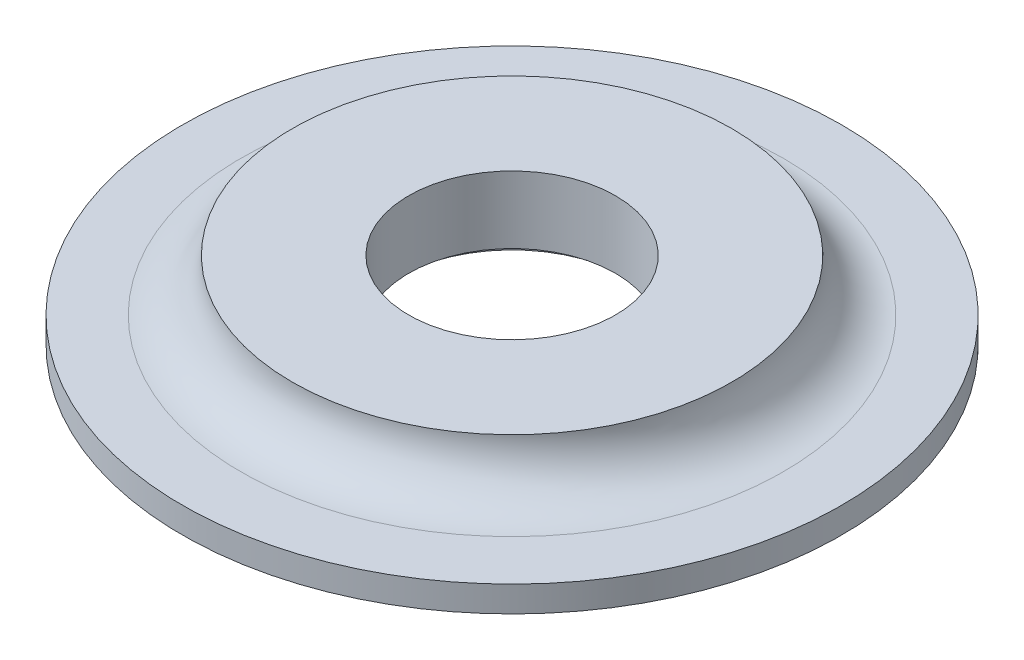
ISO-10303-21;
HEADER;
FILE_DESCRIPTION(('STEP AP214'),'2;1');
FILE_NAME('part.step','',(''),(''),'','','');
FILE_SCHEMA(('AUTOMOTIVE_DESIGN { 1 0 10303 214 1 1 1 1 }'));
ENDSEC;
DATA;
#1=APPLICATION_CONTEXT('core data for automotive mechanical design processes');
#2=APPLICATION_PROTOCOL_DEFINITION('international standard','automotive_design',2000,#1);
#3=PRODUCT_CONTEXT('',#1,'mechanical');
#4=PRODUCT('Part','Part','',(#3));
#5=PRODUCT_RELATED_PRODUCT_CATEGORY('part','',(#4));
#6=PRODUCT_DEFINITION_FORMATION('','',#4);
#7=PRODUCT_DEFINITION_CONTEXT('part definition',#1,'design');
#8=PRODUCT_DEFINITION('design','',#6,#7);
#9=PRODUCT_DEFINITION_SHAPE('','',#8);
#10=(LENGTH_UNIT() NAMED_UNIT(*) SI_UNIT(.MILLI.,.METRE.));
#11=(NAMED_UNIT(*) PLANE_ANGLE_UNIT() SI_UNIT($,.RADIAN.));
#12=(NAMED_UNIT(*) SI_UNIT($,.STERADIAN.) SOLID_ANGLE_UNIT());
#13=UNCERTAINTY_MEASURE_WITH_UNIT(LENGTH_MEASURE(1.E-05),#10,'distance_accuracy_value','');
#14=(GEOMETRIC_REPRESENTATION_CONTEXT(3) GLOBAL_UNCERTAINTY_ASSIGNED_CONTEXT((#13)) GLOBAL_UNIT_ASSIGNED_CONTEXT((#10,
#11,#12)) REPRESENTATION_CONTEXT('',''));
#15=CARTESIAN_POINT('',(0.,0.,0.));
#16=DIRECTION('',(0.,0.,1.));
#17=DIRECTION('',(1.,0.,0.));
#18=AXIS2_PLACEMENT_3D('',#15,#16,#17);
#19=CARTESIAN_POINT('',(0.,0.,0.));
#20=DIRECTION('',(0.,-1.,0.));
#21=DIRECTION('',(0.,0.,-1.));
#22=AXIS2_PLACEMENT_3D('',#19,#20,#21);
#23=CYLINDRICAL_SURFACE('',#22,25.5);
#24=CARTESIAN_POINT('',(0.,2.00000000000001,0.));
#25=DIRECTION('',(0.,-1.,0.));
#26=DIRECTION('',(0.,0.,-1.));
#27=AXIS2_PLACEMENT_3D('',#24,#25,#26);
#28=CIRCLE('',#27,25.5);
#29=CARTESIAN_POINT('',(0.,2.00000000000001,-25.5));
#30=VERTEX_POINT('',#29);
#31=EDGE_CURVE('E10',#30,#30,#28,.T.);
#32=ORIENTED_EDGE('',*,*,#31,.T.);
#33=EDGE_LOOP('',(#32));
#34=FACE_BOUND('',#33,.T.);
#35=CARTESIAN_POINT('',(0.,0.,0.));
#36=DIRECTION('',(0.,-1.,0.));
#37=DIRECTION('',(0.,0.,-1.));
#38=AXIS2_PLACEMENT_3D('',#35,#36,#37);
#39=CIRCLE('',#38,25.5);
#40=CARTESIAN_POINT('',(0.,0.,-25.5));
#41=VERTEX_POINT('',#40);
#42=EDGE_CURVE('E61',#41,#41,#39,.T.);
#43=ORIENTED_EDGE('',*,*,#42,.F.);
#44=EDGE_LOOP('',(#43));
#45=FACE_BOUND('',#44,.T.);
#46=ADVANCED_FACE('F33',(#34,#45),#23,.T.);
#47=CARTESIAN_POINT('',(21.,2.,0.));
#48=DIRECTION('',(0.,1.,0.));
#49=DIRECTION('',(0.,0.,1.));
#50=AXIS2_PLACEMENT_3D('',#47,#48,#49);
#51=PLANE('',#50);
#52=CARTESIAN_POINT('',(0.,2.,0.));
#53=DIRECTION('',(0.,-1.,0.));
#54=DIRECTION('',(0.,0.,-1.));
#55=AXIS2_PLACEMENT_3D('',#52,#53,#54);
#56=CIRCLE('',#55,21.);
#57=CARTESIAN_POINT('',(0.,2.,-21.));
#58=VERTEX_POINT('',#57);
#59=EDGE_CURVE('E39',#58,#58,#56,.T.);
#60=ORIENTED_EDGE('',*,*,#59,.T.);
#61=EDGE_LOOP('',(#60));
#62=FACE_BOUND('',#61,.T.);
#63=ORIENTED_EDGE('',*,*,#31,.F.);
#64=EDGE_LOOP('',(#63));
#65=FACE_BOUND('',#64,.T.);
#66=ADVANCED_FACE('F69',(#62,#65),#51,.T.);
#67=CARTESIAN_POINT('',(0.,6.,0.));
#68=DIRECTION('',(0.,-1.,0.));
#69=DIRECTION('',(0.,0.,-1.));
#70=AXIS2_PLACEMENT_3D('',#67,#68,#69);
#71=TOROIDAL_SURFACE('',#70,21.,4.);
#72=CARTESIAN_POINT('',(0.,6.,0.));
#73=DIRECTION('',(0.,-1.,0.));
#74=DIRECTION('',(0.,0.,-1.));
#75=AXIS2_PLACEMENT_3D('',#72,#73,#74);
#76=CIRCLE('',#75,17.);
#77=CARTESIAN_POINT('',(0.,6.,-17.));
#78=VERTEX_POINT('',#77);
#79=EDGE_CURVE('E43',#78,#78,#76,.T.);
#80=ORIENTED_EDGE('',*,*,#79,.T.);
#81=EDGE_LOOP('',(#80));
#82=FACE_BOUND('',#81,.T.);
#83=ORIENTED_EDGE('',*,*,#59,.F.);
#84=EDGE_LOOP('',(#83));
#85=FACE_BOUND('',#84,.T.);
#86=ADVANCED_FACE('F73',(#82,#85),#71,.F.);
#87=CARTESIAN_POINT('',(17.,6.,0.));
#88=DIRECTION('',(0.,1.,0.));
#89=DIRECTION('',(0.,0.,1.));
#90=AXIS2_PLACEMENT_3D('',#87,#88,#89);
#91=PLANE('',#90);
#92=CARTESIAN_POINT('',(0.,6.00000000000001,0.));
#93=DIRECTION('',(0.,-1.,0.));
#94=DIRECTION('',(0.,0.,-1.));
#95=AXIS2_PLACEMENT_3D('',#92,#93,#94);
#96=CIRCLE('',#95,8.);
#97=CARTESIAN_POINT('',(0.,6.00000000000001,-8.));
#98=VERTEX_POINT('',#97);
#99=EDGE_CURVE('E47',#98,#98,#96,.T.);
#100=ORIENTED_EDGE('',*,*,#99,.T.);
#101=EDGE_LOOP('',(#100));
#102=FACE_BOUND('',#101,.T.);
#103=ORIENTED_EDGE('',*,*,#79,.F.);
#104=EDGE_LOOP('',(#103));
#105=FACE_BOUND('',#104,.T.);
#106=ADVANCED_FACE('F77',(#102,#105),#91,.T.);
#107=CARTESIAN_POINT('',(0.,0.,0.));
#108=DIRECTION('',(0.,-1.,0.));
#109=DIRECTION('',(0.,0.,-1.));
#110=AXIS2_PLACEMENT_3D('',#107,#108,#109);
#111=CYLINDRICAL_SURFACE('',#110,8.);
#112=CARTESIAN_POINT('',(0.,0.8,0.));
#113=DIRECTION('',(0.,-1.,0.));
#114=DIRECTION('',(0.,0.,-1.));
#115=AXIS2_PLACEMENT_3D('',#112,#113,#114);
#116=CIRCLE('',#115,8.);
#117=CARTESIAN_POINT('',(0.,0.8,-8.));
#118=VERTEX_POINT('',#117);
#119=EDGE_CURVE('E52',#118,#118,#116,.T.);
#120=ORIENTED_EDGE('',*,*,#119,.T.);
#121=EDGE_LOOP('',(#120));
#122=FACE_BOUND('',#121,.T.);
#123=ORIENTED_EDGE('',*,*,#99,.F.);
#124=EDGE_LOOP('',(#123));
#125=FACE_BOUND('',#124,.T.);
#126=ADVANCED_FACE('F84',(#122,#125),#111,.F.);
#127=CARTESIAN_POINT('',(8.,0.8,0.));
#128=DIRECTION('',(0.,-1.,0.));
#129=DIRECTION('',(0.,0.,-1.));
#130=AXIS2_PLACEMENT_3D('',#127,#128,#129);
#131=PLANE('',#130);
#132=CARTESIAN_POINT('',(0.,0.8,0.));
#133=DIRECTION('',(0.,-1.,0.));
#134=DIRECTION('',(0.,0.,-1.));
#135=AXIS2_PLACEMENT_3D('',#132,#133,#134);
#136=CIRCLE('',#135,9.);
#137=CARTESIAN_POINT('',(0.,0.8,-9.));
#138=VERTEX_POINT('',#137);
#139=EDGE_CURVE('E55',#138,#138,#136,.T.);
#140=ORIENTED_EDGE('',*,*,#139,.T.);
#141=EDGE_LOOP('',(#140));
#142=FACE_BOUND('',#141,.T.);
#143=ORIENTED_EDGE('',*,*,#119,.F.);
#144=EDGE_LOOP('',(#143));
#145=FACE_BOUND('',#144,.T.);
#146=ADVANCED_FACE('F88',(#142,#145),#131,.T.);
#147=CARTESIAN_POINT('',(0.,0.,0.));
#148=DIRECTION('',(0.,-1.,0.));
#149=DIRECTION('',(0.,0.,-1.));
#150=AXIS2_PLACEMENT_3D('',#147,#148,#149);
#151=CYLINDRICAL_SURFACE('',#150,9.);
#152=CARTESIAN_POINT('',(0.,0.,0.));
#153=DIRECTION('',(0.,-1.,0.));
#154=DIRECTION('',(0.,0.,-1.));
#155=AXIS2_PLACEMENT_3D('',#152,#153,#154);
#156=CIRCLE('',#155,9.);
#157=CARTESIAN_POINT('',(0.,0.,-9.));
#158=VERTEX_POINT('',#157);
#159=EDGE_CURVE('E58',#158,#158,#156,.T.);
#160=ORIENTED_EDGE('',*,*,#159,.T.);
#161=EDGE_LOOP('',(#160));
#162=FACE_BOUND('',#161,.T.);
#163=ORIENTED_EDGE('',*,*,#139,.F.);
#164=EDGE_LOOP('',(#163));
#165=FACE_BOUND('',#164,.T.);
#166=ADVANCED_FACE('F92',(#162,#165),#151,.F.);
#167=CARTESIAN_POINT('',(9.,0.,0.));
#168=DIRECTION('',(0.,-1.,0.));
#169=DIRECTION('',(0.,0.,-1.));
#170=AXIS2_PLACEMENT_3D('',#167,#168,#169);
#171=PLANE('',#170);
#172=ORIENTED_EDGE('',*,*,#42,.T.);
#173=EDGE_LOOP('',(#172));
#174=FACE_BOUND('',#173,.T.);
#175=ORIENTED_EDGE('',*,*,#159,.F.);
#176=EDGE_LOOP('',(#175));
#177=FACE_BOUND('',#176,.T.);
#178=ADVANCED_FACE('F65',(#174,#177),#171,.T.);
#179=CLOSED_SHELL('',(#46,#66,#86,#106,#126,#146,#166,#178));
#180=MANIFOLD_SOLID_BREP('B2',#179);
#181=ADVANCED_BREP_SHAPE_REPRESENTATION('',(#18,#180),#14);
#182=SHAPE_DEFINITION_REPRESENTATION(#9,#181);
ENDSEC;
END-ISO-10303-21;
